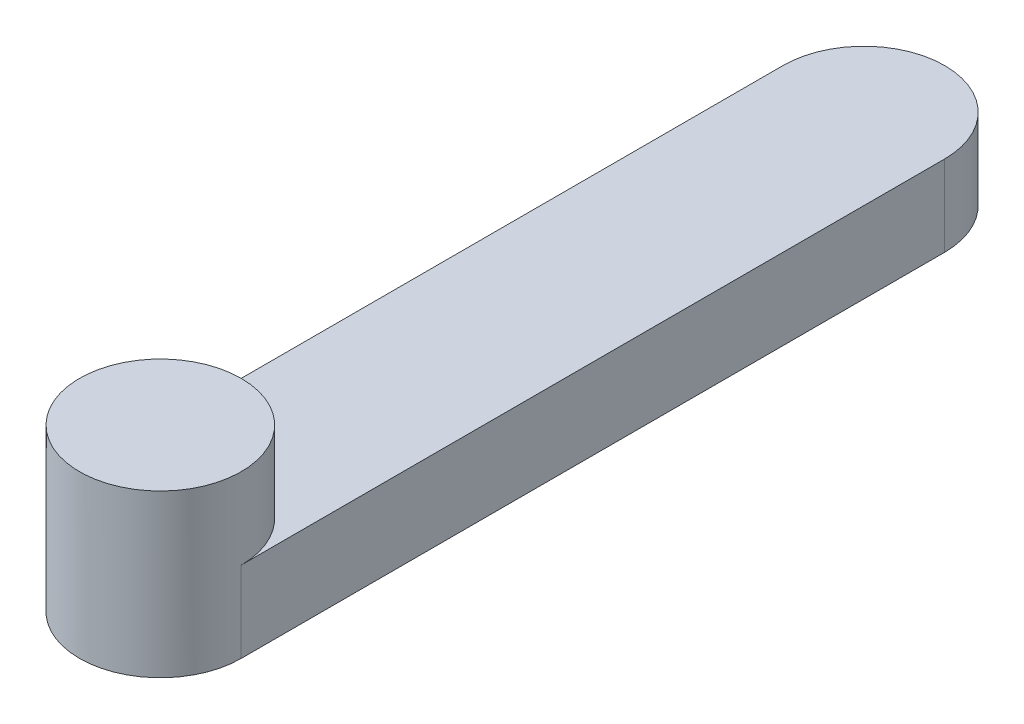
ISO-10303-21;
HEADER;
FILE_DESCRIPTION(('STEP AP214'),'2;1');
FILE_NAME('part.step','',(''),(''),'','','');
FILE_SCHEMA(('AUTOMOTIVE_DESIGN { 1 0 10303 214 1 1 1 1 }'));
ENDSEC;
DATA;
#1=APPLICATION_CONTEXT('core data for automotive mechanical design processes');
#2=APPLICATION_PROTOCOL_DEFINITION('international standard','automotive_design',2000,#1);
#3=PRODUCT_CONTEXT('',#1,'mechanical');
#4=PRODUCT('Part','Part','',(#3));
#5=PRODUCT_RELATED_PRODUCT_CATEGORY('part','',(#4));
#6=PRODUCT_DEFINITION_FORMATION('','',#4);
#7=PRODUCT_DEFINITION_CONTEXT('part definition',#1,'design');
#8=PRODUCT_DEFINITION('design','',#6,#7);
#9=PRODUCT_DEFINITION_SHAPE('','',#8);
#10=(LENGTH_UNIT() NAMED_UNIT(*) SI_UNIT(.MILLI.,.METRE.));
#11=(NAMED_UNIT(*) PLANE_ANGLE_UNIT() SI_UNIT($,.RADIAN.));
#12=(NAMED_UNIT(*) SI_UNIT($,.STERADIAN.) SOLID_ANGLE_UNIT());
#13=UNCERTAINTY_MEASURE_WITH_UNIT(LENGTH_MEASURE(1.E-05),#10,'distance_accuracy_value','');
#14=(GEOMETRIC_REPRESENTATION_CONTEXT(3) GLOBAL_UNCERTAINTY_ASSIGNED_CONTEXT((#13)) GLOBAL_UNIT_ASSIGNED_CONTEXT((#10,
#11,#12)) REPRESENTATION_CONTEXT('',''));
#15=CARTESIAN_POINT('',(0.,0.,0.));
#16=DIRECTION('',(0.,0.,1.));
#17=DIRECTION('',(1.,0.,0.));
#18=AXIS2_PLACEMENT_3D('',#15,#16,#17);
#19=CARTESIAN_POINT('',(0.,2.54,0.));
#20=DIRECTION('',(0.,-1.,0.));
#21=DIRECTION('',(0.,0.,-1.));
#22=AXIS2_PLACEMENT_3D('',#19,#20,#21);
#23=CYLINDRICAL_SURFACE('',#22,2.54);
#24=CARTESIAN_POINT('',(0.,0.,0.));
#25=DIRECTION('',(0.,1.,0.));
#26=DIRECTION('',(0.,0.,1.));
#27=AXIS2_PLACEMENT_3D('',#24,#25,#26);
#28=CIRCLE('',#27,2.54);
#29=CARTESIAN_POINT('',(2.54,0.,0.));
#30=VERTEX_POINT('',#29);
#31=CARTESIAN_POINT('',(-2.54,0.,0.));
#32=VERTEX_POINT('',#31);
#33=EDGE_CURVE('E98',#30,#32,#28,.T.);
#34=ORIENTED_EDGE('',*,*,#33,.T.);
#35=DIRECTION('',(0.,-1.,0.));
#36=VECTOR('',#35,1.);
#37=CARTESIAN_POINT('',(-2.54,2.54,0.));
#38=LINE('',#37,#36);
#39=CARTESIAN_POINT('',(-2.54,2.54,0.));
#40=VERTEX_POINT('',#39);
#41=EDGE_CURVE('E11',#40,#32,#38,.T.);
#42=ORIENTED_EDGE('',*,*,#41,.F.);
#43=CARTESIAN_POINT('',(0.,2.54,0.));
#44=DIRECTION('',(0.,1.,0.));
#45=DIRECTION('',(0.,0.,1.));
#46=AXIS2_PLACEMENT_3D('',#43,#44,#45);
#47=CIRCLE('',#46,2.54);
#48=CARTESIAN_POINT('',(2.54,2.54,0.));
#49=VERTEX_POINT('',#48);
#50=EDGE_CURVE('E102',#49,#40,#47,.T.);
#51=ORIENTED_EDGE('',*,*,#50,.F.);
#52=DIRECTION('',(0.,-1.,0.));
#53=VECTOR('',#52,1.);
#54=CARTESIAN_POINT('',(2.54,2.54,0.));
#55=LINE('',#54,#53);
#56=EDGE_CURVE('E86',#49,#30,#55,.T.);
#57=ORIENTED_EDGE('',*,*,#56,.T.);
#58=EDGE_LOOP('',(#34,#42,#51,#57));
#59=FACE_BOUND('',#58,.T.);
#60=ADVANCED_FACE('F35',(#59),#23,.T.);
#61=CARTESIAN_POINT('',(-2.54,2.54,0.));
#62=DIRECTION('',(1.,0.,0.));
#63=DIRECTION('',(0.,0.,-1.));
#64=AXIS2_PLACEMENT_3D('',#61,#62,#63);
#65=PLANE('',#64);
#66=DIRECTION('',(0.,0.,1.));
#67=VECTOR('',#66,1.);
#68=CARTESIAN_POINT('',(-2.54,0.,0.));
#69=LINE('',#68,#67);
#70=CARTESIAN_POINT('',(-2.54,0.,22.098));
#71=VERTEX_POINT('',#70);
#72=EDGE_CURVE('E116',#32,#71,#69,.T.);
#73=ORIENTED_EDGE('',*,*,#72,.T.);
#74=DIRECTION('',(0.,-1.,0.));
#75=VECTOR('',#74,1.);
#76=CARTESIAN_POINT('',(-2.54,2.54,22.098));
#77=LINE('',#76,#75);
#78=CARTESIAN_POINT('',(-2.54,2.54,22.098));
#79=VERTEX_POINT('',#78);
#80=EDGE_CURVE('E44',#79,#71,#77,.T.);
#81=ORIENTED_EDGE('',*,*,#80,.F.);
#82=DIRECTION('',(0.,0.,1.));
#83=VECTOR('',#82,1.);
#84=CARTESIAN_POINT('',(-2.54,2.54,0.));
#85=LINE('',#84,#83);
#86=EDGE_CURVE('E82',#40,#79,#85,.T.);
#87=ORIENTED_EDGE('',*,*,#86,.F.);
#88=ORIENTED_EDGE('',*,*,#41,.T.);
#89=EDGE_LOOP('',(#73,#81,#87,#88));
#90=FACE_BOUND('',#89,.T.);
#91=ADVANCED_FACE('F123',(#90),#65,.F.);
#92=CARTESIAN_POINT('',(0.,2.54,22.098));
#93=DIRECTION('',(0.,-1.,0.));
#94=DIRECTION('',(0.,0.,-1.));
#95=AXIS2_PLACEMENT_3D('',#92,#93,#94);
#96=CYLINDRICAL_SURFACE('',#95,2.54);
#97=CARTESIAN_POINT('',(0.,0.,22.098));
#98=DIRECTION('',(0.,1.,0.));
#99=DIRECTION('',(0.,0.,1.));
#100=AXIS2_PLACEMENT_3D('',#97,#98,#99);
#101=CIRCLE('',#100,2.54);
#102=CARTESIAN_POINT('',(2.54,0.,22.098));
#103=VERTEX_POINT('',#102);
#104=EDGE_CURVE('E72',#71,#103,#101,.T.);
#105=ORIENTED_EDGE('',*,*,#104,.T.);
#106=DIRECTION('',(0.,-1.,0.));
#107=VECTOR('',#106,1.);
#108=CARTESIAN_POINT('',(2.54,2.54,22.098));
#109=LINE('',#108,#107);
#110=CARTESIAN_POINT('',(2.54,2.54,22.098));
#111=VERTEX_POINT('',#110);
#112=EDGE_CURVE('E85',#111,#103,#109,.T.);
#113=ORIENTED_EDGE('',*,*,#112,.F.);
#114=CARTESIAN_POINT('',(0.,2.54,22.098));
#115=DIRECTION('',(0.,1.,0.));
#116=DIRECTION('',(0.,0.,1.));
#117=AXIS2_PLACEMENT_3D('',#114,#115,#116);
#118=CIRCLE('',#117,2.54);
#119=EDGE_CURVE('E92',#111,#79,#118,.T.);
#120=ORIENTED_EDGE('',*,*,#119,.T.);
#121=ORIENTED_EDGE('',*,*,#80,.T.);
#122=EDGE_LOOP('',(#105,#113,#120,#121));
#123=FACE_BOUND('',#122,.T.);
#124=CARTESIAN_POINT('',(0.,5.08,22.098));
#125=DIRECTION('',(0.,1.,0.));
#126=DIRECTION('',(0.,0.,-1.));
#127=AXIS2_PLACEMENT_3D('',#124,#125,#126);
#128=CIRCLE('',#127,2.54);
#129=CARTESIAN_POINT('',(0.,5.08,19.558));
#130=VERTEX_POINT('',#129);
#131=EDGE_CURVE('E95',#130,#130,#128,.T.);
#132=ORIENTED_EDGE('',*,*,#131,.F.);
#133=EDGE_LOOP('',(#132));
#134=FACE_BOUND('',#133,.T.);
#135=ADVANCED_FACE('F90',(#123,#134),#96,.T.);
#136=CARTESIAN_POINT('',(2.54,2.54,0.));
#137=DIRECTION('',(-1.,0.,0.));
#138=DIRECTION('',(0.,0.,1.));
#139=AXIS2_PLACEMENT_3D('',#136,#137,#138);
#140=PLANE('',#139);
#141=DIRECTION('',(0.,0.,-1.));
#142=VECTOR('',#141,1.);
#143=CARTESIAN_POINT('',(2.54,0.,0.));
#144=LINE('',#143,#142);
#145=EDGE_CURVE('E77',#103,#30,#144,.T.);
#146=ORIENTED_EDGE('',*,*,#145,.T.);
#147=ORIENTED_EDGE('',*,*,#56,.F.);
#148=DIRECTION('',(0.,0.,-1.));
#149=VECTOR('',#148,1.);
#150=CARTESIAN_POINT('',(2.54,2.54,0.));
#151=LINE('',#150,#149);
#152=EDGE_CURVE('E53',#111,#49,#151,.T.);
#153=ORIENTED_EDGE('',*,*,#152,.F.);
#154=ORIENTED_EDGE('',*,*,#112,.T.);
#155=EDGE_LOOP('',(#146,#147,#153,#154));
#156=FACE_BOUND('',#155,.T.);
#157=ADVANCED_FACE('F84',(#156),#140,.F.);
#158=CARTESIAN_POINT('',(0.,2.54,0.));
#159=DIRECTION('',(0.,1.,0.));
#160=DIRECTION('',(0.,0.,1.));
#161=AXIS2_PLACEMENT_3D('',#158,#159,#160);
#162=PLANE('',#161);
#163=ORIENTED_EDGE('',*,*,#119,.F.);
#164=ORIENTED_EDGE('',*,*,#152,.T.);
#165=ORIENTED_EDGE('',*,*,#50,.T.);
#166=ORIENTED_EDGE('',*,*,#86,.T.);
#167=EDGE_LOOP('',(#163,#164,#165,#166));
#168=FACE_BOUND('',#167,.T.);
#169=ADVANCED_FACE('F94',(#168),#162,.T.);
#170=CARTESIAN_POINT('',(0.,0.,0.));
#171=DIRECTION('',(0.,1.,0.));
#172=DIRECTION('',(0.,0.,1.));
#173=AXIS2_PLACEMENT_3D('',#170,#171,#172);
#174=PLANE('',#173);
#175=ORIENTED_EDGE('',*,*,#33,.F.);
#176=ORIENTED_EDGE('',*,*,#145,.F.);
#177=ORIENTED_EDGE('',*,*,#104,.F.);
#178=ORIENTED_EDGE('',*,*,#72,.F.);
#179=EDGE_LOOP('',(#175,#176,#177,#178));
#180=FACE_BOUND('',#179,.T.);
#181=ADVANCED_FACE('F115',(#180),#174,.F.);
#182=CARTESIAN_POINT('',(0.,5.08,22.098));
#183=DIRECTION('',(0.,-1.,0.));
#184=DIRECTION('',(0.,0.,-1.));
#185=AXIS2_PLACEMENT_3D('',#182,#183,#184);
#186=PLANE('',#185);
#187=ORIENTED_EDGE('',*,*,#131,.T.);
#188=EDGE_LOOP('',(#187));
#189=FACE_BOUND('',#188,.T.);
#190=ADVANCED_FACE('F135',(#189),#186,.F.);
#191=CLOSED_SHELL('',(#60,#91,#135,#157,#169,#181,#190));
#192=MANIFOLD_SOLID_BREP('B2',#191);
#193=ADVANCED_BREP_SHAPE_REPRESENTATION('',(#18,#192),#14);
#194=SHAPE_DEFINITION_REPRESENTATION(#9,#193);
ENDSEC;
END-ISO-10303-21;
